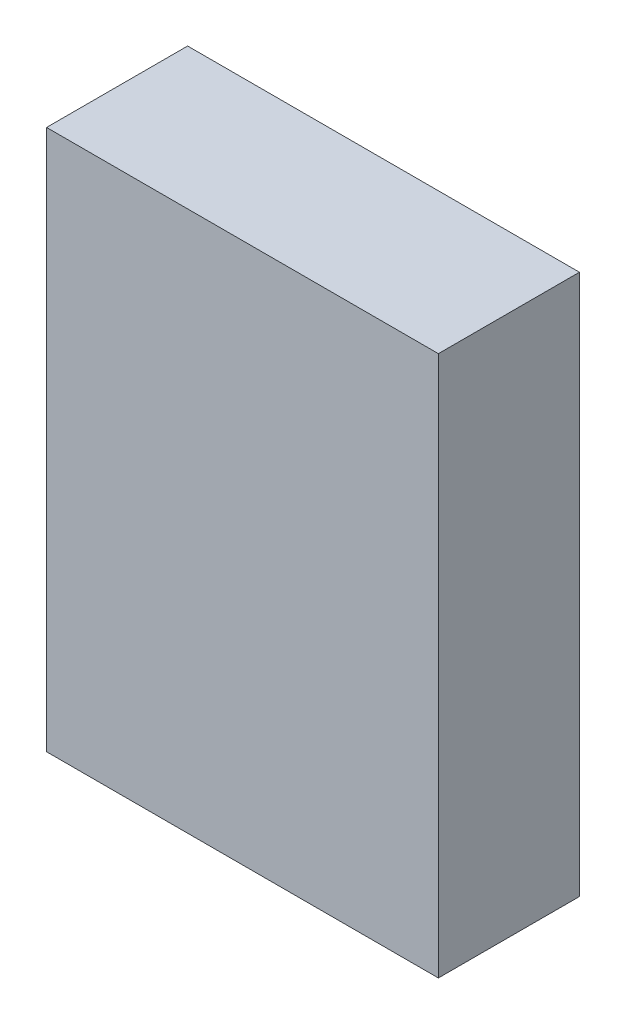
ISO-10303-21;
HEADER;
FILE_DESCRIPTION(('STEP AP214'),'2;1');
FILE_NAME('part.step','',(''),(''),'','','');
FILE_SCHEMA(('AUTOMOTIVE_DESIGN { 1 0 10303 214 1 1 1 1 }'));
ENDSEC;
DATA;
#1=APPLICATION_CONTEXT('core data for automotive mechanical design processes');
#2=APPLICATION_PROTOCOL_DEFINITION('international standard','automotive_design',2000,#1);
#3=PRODUCT_CONTEXT('',#1,'mechanical');
#4=PRODUCT('Part','Part','',(#3));
#5=PRODUCT_RELATED_PRODUCT_CATEGORY('part','',(#4));
#6=PRODUCT_DEFINITION_FORMATION('','',#4);
#7=PRODUCT_DEFINITION_CONTEXT('part definition',#1,'design');
#8=PRODUCT_DEFINITION('design','',#6,#7);
#9=PRODUCT_DEFINITION_SHAPE('','',#8);
#10=(LENGTH_UNIT() NAMED_UNIT(*) SI_UNIT(.MILLI.,.METRE.));
#11=(NAMED_UNIT(*) PLANE_ANGLE_UNIT() SI_UNIT($,.RADIAN.));
#12=(NAMED_UNIT(*) SI_UNIT($,.STERADIAN.) SOLID_ANGLE_UNIT());
#13=UNCERTAINTY_MEASURE_WITH_UNIT(LENGTH_MEASURE(1.E-05),#10,'distance_accuracy_value','');
#14=(GEOMETRIC_REPRESENTATION_CONTEXT(3) GLOBAL_UNCERTAINTY_ASSIGNED_CONTEXT((#13)) GLOBAL_UNIT_ASSIGNED_CONTEXT((#10,
#11,#12)) REPRESENTATION_CONTEXT('',''));
#15=CARTESIAN_POINT('',(0.,0.,0.));
#16=DIRECTION('',(0.,0.,1.));
#17=DIRECTION('',(1.,0.,0.));
#18=AXIS2_PLACEMENT_3D('',#15,#16,#17);
#19=CARTESIAN_POINT('',(0.,0.,18.));
#20=DIRECTION('',(1.,0.,0.));
#21=DIRECTION('',(0.,0.,-1.));
#22=AXIS2_PLACEMENT_3D('',#19,#20,#21);
#23=PLANE('',#22);
#24=DIRECTION('',(0.,-1.,0.));
#25=VECTOR('',#24,1.);
#26=CARTESIAN_POINT('',(0.,0.,0.));
#27=LINE('',#26,#25);
#28=CARTESIAN_POINT('',(0.,69.,0.));
#29=VERTEX_POINT('',#28);
#30=CARTESIAN_POINT('',(0.,0.,0.));
#31=VERTEX_POINT('',#30);
#32=EDGE_CURVE('E96',#29,#31,#27,.T.);
#33=ORIENTED_EDGE('',*,*,#32,.T.);
#34=DIRECTION('',(0.,0.,-1.));
#35=VECTOR('',#34,1.);
#36=CARTESIAN_POINT('',(0.,0.,18.));
#37=LINE('',#36,#35);
#38=CARTESIAN_POINT('',(0.,0.,18.));
#39=VERTEX_POINT('',#38);
#40=EDGE_CURVE('E11',#39,#31,#37,.T.);
#41=ORIENTED_EDGE('',*,*,#40,.F.);
#42=DIRECTION('',(0.,-1.,0.));
#43=VECTOR('',#42,1.);
#44=CARTESIAN_POINT('',(0.,0.,18.));
#45=LINE('',#44,#43);
#46=CARTESIAN_POINT('',(0.,69.,18.));
#47=VERTEX_POINT('',#46);
#48=EDGE_CURVE('E84',#47,#39,#45,.T.);
#49=ORIENTED_EDGE('',*,*,#48,.F.);
#50=DIRECTION('',(0.,0.,-1.));
#51=VECTOR('',#50,1.);
#52=CARTESIAN_POINT('',(0.,69.,18.));
#53=LINE('',#52,#51);
#54=EDGE_CURVE('E92',#47,#29,#53,.T.);
#55=ORIENTED_EDGE('',*,*,#54,.T.);
#56=EDGE_LOOP('',(#33,#41,#49,#55));
#57=FACE_BOUND('',#56,.T.);
#58=ADVANCED_FACE('F33',(#57),#23,.F.);
#59=CARTESIAN_POINT('',(0.,0.,18.));
#60=DIRECTION('',(0.,1.,0.));
#61=DIRECTION('',(0.,0.,1.));
#62=AXIS2_PLACEMENT_3D('',#59,#60,#61);
#63=PLANE('',#62);
#64=DIRECTION('',(1.,0.,0.));
#65=VECTOR('',#64,1.);
#66=CARTESIAN_POINT('',(0.,0.,0.));
#67=LINE('',#66,#65);
#68=CARTESIAN_POINT('',(50.,0.,0.));
#69=VERTEX_POINT('',#68);
#70=EDGE_CURVE('E88',#31,#69,#67,.T.);
#71=ORIENTED_EDGE('',*,*,#70,.T.);
#72=DIRECTION('',(0.,0.,-1.));
#73=VECTOR('',#72,1.);
#74=CARTESIAN_POINT('',(50.,0.,18.));
#75=LINE('',#74,#73);
#76=CARTESIAN_POINT('',(50.,0.,18.));
#77=VERTEX_POINT('',#76);
#78=EDGE_CURVE('E41',#77,#69,#75,.T.);
#79=ORIENTED_EDGE('',*,*,#78,.F.);
#80=DIRECTION('',(1.,0.,0.));
#81=VECTOR('',#80,1.);
#82=CARTESIAN_POINT('',(0.,0.,18.));
#83=LINE('',#82,#81);
#84=EDGE_CURVE('E79',#39,#77,#83,.T.);
#85=ORIENTED_EDGE('',*,*,#84,.F.);
#86=ORIENTED_EDGE('',*,*,#40,.T.);
#87=EDGE_LOOP('',(#71,#79,#85,#86));
#88=FACE_BOUND('',#87,.T.);
#89=ADVANCED_FACE('F87',(#88),#63,.F.);
#90=CARTESIAN_POINT('',(50.,0.,18.));
#91=DIRECTION('',(-1.,0.,0.));
#92=DIRECTION('',(0.,0.,1.));
#93=AXIS2_PLACEMENT_3D('',#90,#91,#92);
#94=PLANE('',#93);
#95=DIRECTION('',(0.,1.,0.));
#96=VECTOR('',#95,1.);
#97=CARTESIAN_POINT('',(50.,0.,0.));
#98=LINE('',#97,#96);
#99=CARTESIAN_POINT('',(50.,69.,0.));
#100=VERTEX_POINT('',#99);
#101=EDGE_CURVE('E66',#69,#100,#98,.T.);
#102=ORIENTED_EDGE('',*,*,#101,.T.);
#103=DIRECTION('',(0.,0.,-1.));
#104=VECTOR('',#103,1.);
#105=CARTESIAN_POINT('',(50.,69.,18.));
#106=LINE('',#105,#104);
#107=CARTESIAN_POINT('',(50.,69.,18.));
#108=VERTEX_POINT('',#107);
#109=EDGE_CURVE('E89',#108,#100,#106,.T.);
#110=ORIENTED_EDGE('',*,*,#109,.F.);
#111=DIRECTION('',(0.,1.,0.));
#112=VECTOR('',#111,1.);
#113=CARTESIAN_POINT('',(50.,0.,18.));
#114=LINE('',#113,#112);
#115=EDGE_CURVE('E82',#77,#108,#114,.T.);
#116=ORIENTED_EDGE('',*,*,#115,.F.);
#117=ORIENTED_EDGE('',*,*,#78,.T.);
#118=EDGE_LOOP('',(#102,#110,#116,#117));
#119=FACE_BOUND('',#118,.T.);
#120=ADVANCED_FACE('F90',(#119),#94,.F.);
#121=CARTESIAN_POINT('',(0.,69.,18.));
#122=DIRECTION('',(0.,-1.,0.));
#123=DIRECTION('',(0.,0.,-1.));
#124=AXIS2_PLACEMENT_3D('',#121,#122,#123);
#125=PLANE('',#124);
#126=DIRECTION('',(-1.,0.,0.));
#127=VECTOR('',#126,1.);
#128=CARTESIAN_POINT('',(0.,69.,0.));
#129=LINE('',#128,#127);
#130=EDGE_CURVE('E72',#100,#29,#129,.T.);
#131=ORIENTED_EDGE('',*,*,#130,.T.);
#132=ORIENTED_EDGE('',*,*,#54,.F.);
#133=DIRECTION('',(-1.,0.,0.));
#134=VECTOR('',#133,1.);
#135=CARTESIAN_POINT('',(0.,69.,18.));
#136=LINE('',#135,#134);
#137=EDGE_CURVE('E49',#108,#47,#136,.T.);
#138=ORIENTED_EDGE('',*,*,#137,.F.);
#139=ORIENTED_EDGE('',*,*,#109,.T.);
#140=EDGE_LOOP('',(#131,#132,#138,#139));
#141=FACE_BOUND('',#140,.T.);
#142=ADVANCED_FACE('F103',(#141),#125,.F.);
#143=CARTESIAN_POINT('',(0.,0.,18.));
#144=DIRECTION('',(0.,0.,-1.));
#145=DIRECTION('',(-1.,0.,0.));
#146=AXIS2_PLACEMENT_3D('',#143,#144,#145);
#147=PLANE('',#146);
#148=ORIENTED_EDGE('',*,*,#48,.T.);
#149=ORIENTED_EDGE('',*,*,#84,.T.);
#150=ORIENTED_EDGE('',*,*,#115,.T.);
#151=ORIENTED_EDGE('',*,*,#137,.T.);
#152=EDGE_LOOP('',(#148,#149,#150,#151));
#153=FACE_BOUND('',#152,.T.);
#154=ADVANCED_FACE('F80',(#153),#147,.F.);
#155=CARTESIAN_POINT('',(0.,0.,0.));
#156=DIRECTION('',(0.,0.,-1.));
#157=DIRECTION('',(-1.,0.,0.));
#158=AXIS2_PLACEMENT_3D('',#155,#156,#157);
#159=PLANE('',#158);
#160=ORIENTED_EDGE('',*,*,#32,.F.);
#161=ORIENTED_EDGE('',*,*,#130,.F.);
#162=ORIENTED_EDGE('',*,*,#101,.F.);
#163=ORIENTED_EDGE('',*,*,#70,.F.);
#164=EDGE_LOOP('',(#160,#161,#162,#163));
#165=FACE_BOUND('',#164,.T.);
#166=ADVANCED_FACE('F106',(#165),#159,.T.);
#167=CLOSED_SHELL('',(#58,#89,#120,#142,#154,#166));
#168=MANIFOLD_SOLID_BREP('B2',#167);
#169=ADVANCED_BREP_SHAPE_REPRESENTATION('',(#18,#168),#14);
#170=SHAPE_DEFINITION_REPRESENTATION(#9,#169);
ENDSEC;
END-ISO-10303-21;
